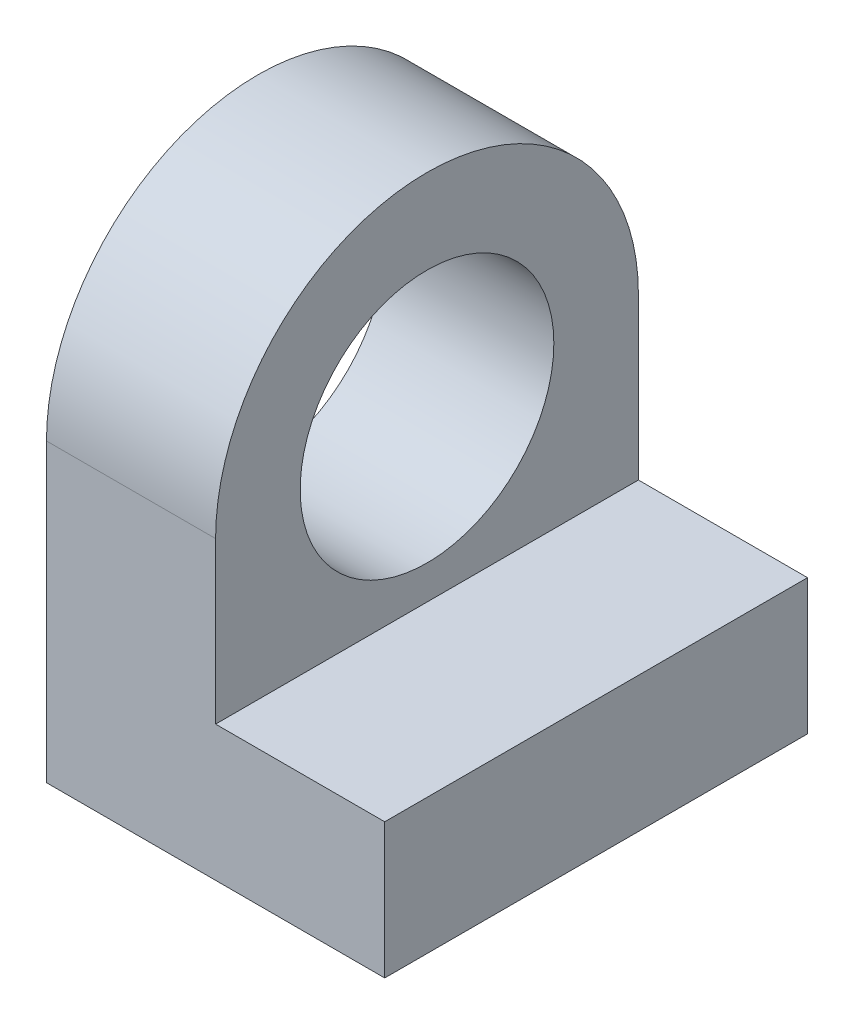
ISO-10303-21;
HEADER;
FILE_DESCRIPTION(('STEP AP214'),'2;1');
FILE_NAME('part.step','',(''),(''),'','','');
FILE_SCHEMA(('AUTOMOTIVE_DESIGN { 1 0 10303 214 1 1 1 1 }'));
ENDSEC;
DATA;
#1=APPLICATION_CONTEXT('core data for automotive mechanical design processes');
#2=APPLICATION_PROTOCOL_DEFINITION('international standard','automotive_design',2000,#1);
#3=PRODUCT_CONTEXT('',#1,'mechanical');
#4=PRODUCT('Part','Part','',(#3));
#5=PRODUCT_RELATED_PRODUCT_CATEGORY('part','',(#4));
#6=PRODUCT_DEFINITION_FORMATION('','',#4);
#7=PRODUCT_DEFINITION_CONTEXT('part definition',#1,'design');
#8=PRODUCT_DEFINITION('design','',#6,#7);
#9=PRODUCT_DEFINITION_SHAPE('','',#8);
#10=(LENGTH_UNIT() NAMED_UNIT(*) SI_UNIT(.MILLI.,.METRE.));
#11=(NAMED_UNIT(*) PLANE_ANGLE_UNIT() SI_UNIT($,.RADIAN.));
#12=(NAMED_UNIT(*) SI_UNIT($,.STERADIAN.) SOLID_ANGLE_UNIT());
#13=UNCERTAINTY_MEASURE_WITH_UNIT(LENGTH_MEASURE(1.E-05),#10,'distance_accuracy_value','');
#14=(GEOMETRIC_REPRESENTATION_CONTEXT(3) GLOBAL_UNCERTAINTY_ASSIGNED_CONTEXT((#13)) GLOBAL_UNIT_ASSIGNED_CONTEXT((#10,
#11,#12)) REPRESENTATION_CONTEXT('',''));
#15=CARTESIAN_POINT('',(0.,0.,0.));
#16=DIRECTION('',(0.,0.,1.));
#17=DIRECTION('',(1.,0.,0.));
#18=AXIS2_PLACEMENT_3D('',#15,#16,#17);
#19=CARTESIAN_POINT('',(10.,17.5,12.5));
#20=DIRECTION('',(-1.,0.,0.));
#21=DIRECTION('',(0.,0.,1.));
#22=AXIS2_PLACEMENT_3D('',#19,#20,#21);
#23=PLANE('',#22);
#24=DIRECTION('',(0.,-1.,0.));
#25=VECTOR('',#24,1.);
#26=CARTESIAN_POINT('',(10.,0.,25.));
#27=LINE('',#26,#25);
#28=CARTESIAN_POINT('',(10.,17.5,25.));
#29=VERTEX_POINT('',#28);
#30=CARTESIAN_POINT('',(10.,8.,25.));
#31=VERTEX_POINT('',#30);
#32=EDGE_CURVE('E112',#29,#31,#27,.T.);
#33=ORIENTED_EDGE('',*,*,#32,.T.);
#34=DIRECTION('',(0.,0.,-1.));
#35=VECTOR('',#34,1.);
#36=CARTESIAN_POINT('',(10.,8.,25.));
#37=LINE('',#36,#35);
#38=CARTESIAN_POINT('',(10.,8.,0.));
#39=VERTEX_POINT('',#38);
#40=EDGE_CURVE('E155',#31,#39,#37,.T.);
#41=ORIENTED_EDGE('',*,*,#40,.T.);
#42=DIRECTION('',(0.,1.,0.));
#43=VECTOR('',#42,1.);
#44=CARTESIAN_POINT('',(10.,17.5,0.));
#45=LINE('',#44,#43);
#46=CARTESIAN_POINT('',(10.,17.5,0.));
#47=VERTEX_POINT('',#46);
#48=EDGE_CURVE('E101',#39,#47,#45,.T.);
#49=ORIENTED_EDGE('',*,*,#48,.T.);
#50=CARTESIAN_POINT('',(10.,17.5,12.5));
#51=DIRECTION('',(1.,0.,0.));
#52=DIRECTION('',(0.,0.,1.));
#53=AXIS2_PLACEMENT_3D('',#50,#51,#52);
#54=CIRCLE('',#53,12.5);
#55=EDGE_CURVE('E68',#47,#29,#54,.T.);
#56=ORIENTED_EDGE('',*,*,#55,.T.);
#57=EDGE_LOOP('',(#33,#41,#49,#56));
#58=FACE_BOUND('',#57,.T.);
#59=CARTESIAN_POINT('',(10.,17.5,12.5));
#60=DIRECTION('',(1.,0.,0.));
#61=DIRECTION('',(0.,0.,-1.));
#62=AXIS2_PLACEMENT_3D('',#59,#60,#61);
#63=CIRCLE('',#62,7.5);
#64=CARTESIAN_POINT('',(10.,17.5,5.));
#65=VERTEX_POINT('',#64);
#66=EDGE_CURVE('E118',#65,#65,#63,.T.);
#67=ORIENTED_EDGE('',*,*,#66,.F.);
#68=EDGE_LOOP('',(#67));
#69=FACE_BOUND('',#68,.T.);
#70=ADVANCED_FACE('F43',(#58,#69),#23,.F.);
#71=CARTESIAN_POINT('',(0.,17.5,12.5));
#72=DIRECTION('',(-1.,0.,0.));
#73=DIRECTION('',(0.,0.,1.));
#74=AXIS2_PLACEMENT_3D('',#71,#72,#73);
#75=PLANE('',#74);
#76=DIRECTION('',(0.,1.,0.));
#77=VECTOR('',#76,1.);
#78=CARTESIAN_POINT('',(0.,17.5,0.));
#79=LINE('',#78,#77);
#80=CARTESIAN_POINT('',(0.,0.,0.));
#81=VERTEX_POINT('',#80);
#82=CARTESIAN_POINT('',(0.,17.5,0.));
#83=VERTEX_POINT('',#82);
#84=EDGE_CURVE('E107',#81,#83,#79,.T.);
#85=ORIENTED_EDGE('',*,*,#84,.F.);
#86=DIRECTION('',(0.,0.,-1.));
#87=VECTOR('',#86,1.);
#88=CARTESIAN_POINT('',(0.,0.,0.));
#89=LINE('',#88,#87);
#90=CARTESIAN_POINT('',(0.,0.,25.));
#91=VERTEX_POINT('',#90);
#92=EDGE_CURVE('E88',#91,#81,#89,.T.);
#93=ORIENTED_EDGE('',*,*,#92,.F.);
#94=DIRECTION('',(0.,-1.,0.));
#95=VECTOR('',#94,1.);
#96=CARTESIAN_POINT('',(0.,0.,25.));
#97=LINE('',#96,#95);
#98=CARTESIAN_POINT('',(0.,17.5,25.));
#99=VERTEX_POINT('',#98);
#100=EDGE_CURVE('E102',#99,#91,#97,.T.);
#101=ORIENTED_EDGE('',*,*,#100,.F.);
#102=CARTESIAN_POINT('',(0.,17.5,12.5));
#103=DIRECTION('',(1.,0.,0.));
#104=DIRECTION('',(0.,0.,1.));
#105=AXIS2_PLACEMENT_3D('',#102,#103,#104);
#106=CIRCLE('',#105,12.5);
#107=EDGE_CURVE('E116',#83,#99,#106,.T.);
#108=ORIENTED_EDGE('',*,*,#107,.F.);
#109=EDGE_LOOP('',(#85,#93,#101,#108));
#110=FACE_BOUND('',#109,.T.);
#111=CARTESIAN_POINT('',(0.,17.5,12.5));
#112=DIRECTION('',(1.,0.,0.));
#113=DIRECTION('',(0.,0.,-1.));
#114=AXIS2_PLACEMENT_3D('',#111,#112,#113);
#115=CIRCLE('',#114,7.5);
#116=CARTESIAN_POINT('',(0.,17.5,5.));
#117=VERTEX_POINT('',#116);
#118=EDGE_CURVE('E124',#117,#117,#115,.T.);
#119=ORIENTED_EDGE('',*,*,#118,.T.);
#120=EDGE_LOOP('',(#119));
#121=FACE_BOUND('',#120,.T.);
#122=ADVANCED_FACE('F114',(#110,#121),#75,.T.);
#123=CARTESIAN_POINT('',(10.,17.5,0.));
#124=DIRECTION('',(0.,0.,1.));
#125=DIRECTION('',(1.,0.,0.));
#126=AXIS2_PLACEMENT_3D('',#123,#124,#125);
#127=PLANE('',#126);
#128=ORIENTED_EDGE('',*,*,#84,.T.);
#129=DIRECTION('',(-1.,0.,0.));
#130=VECTOR('',#129,1.);
#131=CARTESIAN_POINT('',(10.,17.5,0.));
#132=LINE('',#131,#130);
#133=EDGE_CURVE('E11',#47,#83,#132,.T.);
#134=ORIENTED_EDGE('',*,*,#133,.F.);
#135=ORIENTED_EDGE('',*,*,#48,.F.);
#136=DIRECTION('',(-1.,0.,0.));
#137=VECTOR('',#136,1.);
#138=CARTESIAN_POINT('',(20.,8.,0.));
#139=LINE('',#138,#137);
#140=CARTESIAN_POINT('',(20.,8.,0.));
#141=VERTEX_POINT('',#140);
#142=EDGE_CURVE('E59',#141,#39,#139,.T.);
#143=ORIENTED_EDGE('',*,*,#142,.F.);
#144=DIRECTION('',(0.,1.,0.));
#145=VECTOR('',#144,1.);
#146=CARTESIAN_POINT('',(20.,0.,0.));
#147=LINE('',#146,#145);
#148=CARTESIAN_POINT('',(20.,0.,0.));
#149=VERTEX_POINT('',#148);
#150=EDGE_CURVE('E109',#149,#141,#147,.T.);
#151=ORIENTED_EDGE('',*,*,#150,.F.);
#152=DIRECTION('',(-1.,0.,0.));
#153=VECTOR('',#152,1.);
#154=CARTESIAN_POINT('',(10.,0.,0.));
#155=LINE('',#154,#153);
#156=EDGE_CURVE('E93',#149,#81,#155,.T.);
#157=ORIENTED_EDGE('',*,*,#156,.T.);
#158=EDGE_LOOP('',(#128,#134,#135,#143,#151,#157));
#159=FACE_BOUND('',#158,.T.);
#160=ADVANCED_FACE('F45',(#159),#127,.F.);
#161=CARTESIAN_POINT('',(10.,17.5,12.5));
#162=DIRECTION('',(-1.,0.,0.));
#163=DIRECTION('',(0.,0.,1.));
#164=AXIS2_PLACEMENT_3D('',#161,#162,#163);
#165=CYLINDRICAL_SURFACE('',#164,12.5);
#166=ORIENTED_EDGE('',*,*,#107,.T.);
#167=DIRECTION('',(-1.,0.,0.));
#168=VECTOR('',#167,1.);
#169=CARTESIAN_POINT('',(10.,17.5,25.));
#170=LINE('',#169,#168);
#171=EDGE_CURVE('E52',#29,#99,#170,.T.);
#172=ORIENTED_EDGE('',*,*,#171,.F.);
#173=ORIENTED_EDGE('',*,*,#55,.F.);
#174=ORIENTED_EDGE('',*,*,#133,.T.);
#175=EDGE_LOOP('',(#166,#172,#173,#174));
#176=FACE_BOUND('',#175,.T.);
#177=ADVANCED_FACE('F139',(#176),#165,.T.);
#178=CARTESIAN_POINT('',(10.,0.,25.));
#179=DIRECTION('',(0.,0.,-1.));
#180=DIRECTION('',(-1.,0.,0.));
#181=AXIS2_PLACEMENT_3D('',#178,#179,#180);
#182=PLANE('',#181);
#183=ORIENTED_EDGE('',*,*,#100,.T.);
#184=DIRECTION('',(-1.,0.,0.));
#185=VECTOR('',#184,1.);
#186=CARTESIAN_POINT('',(10.,0.,25.));
#187=LINE('',#186,#185);
#188=CARTESIAN_POINT('',(20.,0.,25.));
#189=VERTEX_POINT('',#188);
#190=EDGE_CURVE('E96',#189,#91,#187,.T.);
#191=ORIENTED_EDGE('',*,*,#190,.F.);
#192=DIRECTION('',(0.,-1.,0.));
#193=VECTOR('',#192,1.);
#194=CARTESIAN_POINT('',(20.,8.,25.));
#195=LINE('',#194,#193);
#196=CARTESIAN_POINT('',(20.,8.,25.));
#197=VERTEX_POINT('',#196);
#198=EDGE_CURVE('E154',#197,#189,#195,.T.);
#199=ORIENTED_EDGE('',*,*,#198,.F.);
#200=DIRECTION('',(-1.,0.,0.));
#201=VECTOR('',#200,1.);
#202=CARTESIAN_POINT('',(20.,8.,25.));
#203=LINE('',#202,#201);
#204=EDGE_CURVE('E151',#197,#31,#203,.T.);
#205=ORIENTED_EDGE('',*,*,#204,.T.);
#206=ORIENTED_EDGE('',*,*,#32,.F.);
#207=ORIENTED_EDGE('',*,*,#171,.T.);
#208=EDGE_LOOP('',(#183,#191,#199,#205,#206,#207));
#209=FACE_BOUND('',#208,.T.);
#210=ADVANCED_FACE('F136',(#209),#182,.F.);
#211=CARTESIAN_POINT('',(10.,0.,0.));
#212=DIRECTION('',(0.,1.,0.));
#213=DIRECTION('',(0.,0.,1.));
#214=AXIS2_PLACEMENT_3D('',#211,#212,#213);
#215=PLANE('',#214);
#216=ORIENTED_EDGE('',*,*,#92,.T.);
#217=ORIENTED_EDGE('',*,*,#156,.F.);
#218=DIRECTION('',(0.,0.,-1.));
#219=VECTOR('',#218,1.);
#220=CARTESIAN_POINT('',(20.,0.,25.));
#221=LINE('',#220,#219);
#222=EDGE_CURVE('E158',#189,#149,#221,.T.);
#223=ORIENTED_EDGE('',*,*,#222,.F.);
#224=ORIENTED_EDGE('',*,*,#190,.T.);
#225=EDGE_LOOP('',(#216,#217,#223,#224));
#226=FACE_BOUND('',#225,.T.);
#227=ADVANCED_FACE('F90',(#226),#215,.F.);
#228=CARTESIAN_POINT('',(10.,17.5,12.5));
#229=DIRECTION('',(-1.,0.,0.));
#230=DIRECTION('',(0.,0.,1.));
#231=AXIS2_PLACEMENT_3D('',#228,#229,#230);
#232=CYLINDRICAL_SURFACE('',#231,7.5);
#233=ORIENTED_EDGE('',*,*,#66,.T.);
#234=EDGE_LOOP('',(#233));
#235=FACE_BOUND('',#234,.T.);
#236=ORIENTED_EDGE('',*,*,#118,.F.);
#237=EDGE_LOOP('',(#236));
#238=FACE_BOUND('',#237,.T.);
#239=ADVANCED_FACE('F186',(#235,#238),#232,.F.);
#240=CARTESIAN_POINT('',(20.,8.,25.));
#241=DIRECTION('',(0.,1.,0.));
#242=DIRECTION('',(0.,0.,1.));
#243=AXIS2_PLACEMENT_3D('',#240,#241,#242);
#244=PLANE('',#243);
#245=ORIENTED_EDGE('',*,*,#40,.F.);
#246=ORIENTED_EDGE('',*,*,#204,.F.);
#247=DIRECTION('',(0.,0.,-1.));
#248=VECTOR('',#247,1.);
#249=CARTESIAN_POINT('',(20.,8.,25.));
#250=LINE('',#249,#248);
#251=EDGE_CURVE('E162',#197,#141,#250,.T.);
#252=ORIENTED_EDGE('',*,*,#251,.T.);
#253=ORIENTED_EDGE('',*,*,#142,.T.);
#254=EDGE_LOOP('',(#245,#246,#252,#253));
#255=FACE_BOUND('',#254,.T.);
#256=ADVANCED_FACE('F179',(#255),#244,.T.);
#257=CARTESIAN_POINT('',(20.,0.,0.));
#258=DIRECTION('',(1.,0.,0.));
#259=DIRECTION('',(0.,0.,-1.));
#260=AXIS2_PLACEMENT_3D('',#257,#258,#259);
#261=PLANE('',#260);
#262=ORIENTED_EDGE('',*,*,#222,.T.);
#263=ORIENTED_EDGE('',*,*,#150,.T.);
#264=ORIENTED_EDGE('',*,*,#251,.F.);
#265=ORIENTED_EDGE('',*,*,#198,.T.);
#266=EDGE_LOOP('',(#262,#263,#264,#265));
#267=FACE_BOUND('',#266,.T.);
#268=ADVANCED_FACE('F169',(#267),#261,.T.);
#269=CLOSED_SHELL('',(#70,#122,#160,#177,#210,#227,#239,#256,#268));
#270=MANIFOLD_SOLID_BREP('B2',#269);
#271=ADVANCED_BREP_SHAPE_REPRESENTATION('',(#18,#270),#14);
#272=SHAPE_DEFINITION_REPRESENTATION(#9,#271);
ENDSEC;
END-ISO-10303-21;
